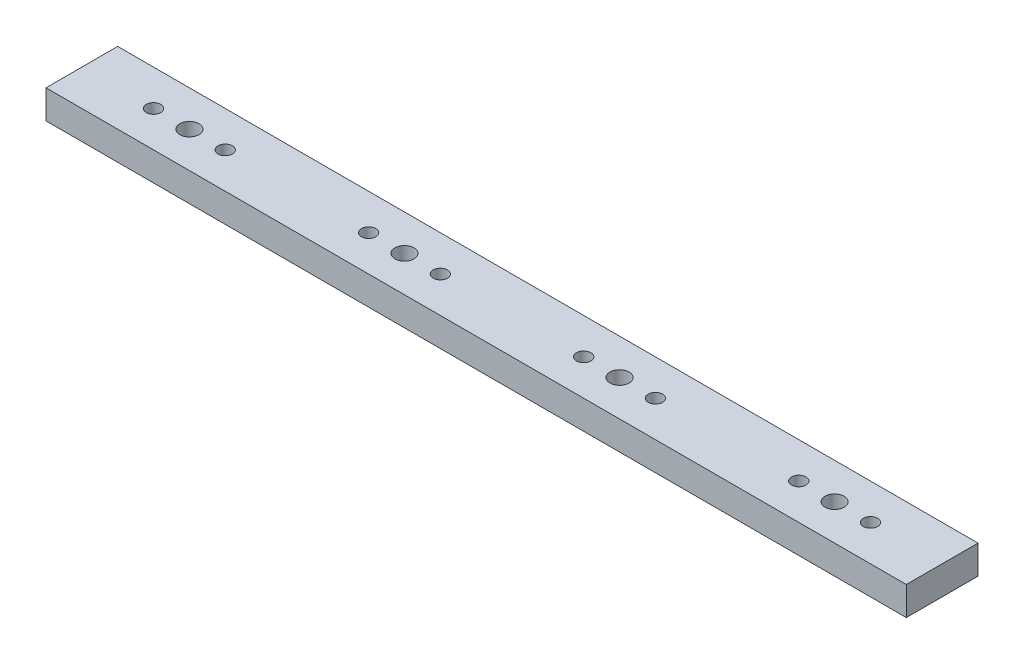
ISO-10303-21;
HEADER;
FILE_DESCRIPTION(('STEP AP214'),'2;1');
FILE_NAME('part.step','',(''),(''),'','','');
FILE_SCHEMA(('AUTOMOTIVE_DESIGN { 1 0 10303 214 1 1 1 1 }'));
ENDSEC;
DATA;
#1=APPLICATION_CONTEXT('core data for automotive mechanical design processes');
#2=APPLICATION_PROTOCOL_DEFINITION('international standard','automotive_design',2000,#1);
#3=PRODUCT_CONTEXT('',#1,'mechanical');
#4=PRODUCT('Part','Part','',(#3));
#5=PRODUCT_RELATED_PRODUCT_CATEGORY('part','',(#4));
#6=PRODUCT_DEFINITION_FORMATION('','',#4);
#7=PRODUCT_DEFINITION_CONTEXT('part definition',#1,'design');
#8=PRODUCT_DEFINITION('design','',#6,#7);
#9=PRODUCT_DEFINITION_SHAPE('','',#8);
#10=(LENGTH_UNIT() NAMED_UNIT(*) SI_UNIT(.MILLI.,.METRE.));
#11=(NAMED_UNIT(*) PLANE_ANGLE_UNIT() SI_UNIT($,.RADIAN.));
#12=(NAMED_UNIT(*) SI_UNIT($,.STERADIAN.) SOLID_ANGLE_UNIT());
#13=UNCERTAINTY_MEASURE_WITH_UNIT(LENGTH_MEASURE(1.E-05),#10,'distance_accuracy_value','');
#14=(GEOMETRIC_REPRESENTATION_CONTEXT(3) GLOBAL_UNCERTAINTY_ASSIGNED_CONTEXT((#13)) GLOBAL_UNIT_ASSIGNED_CONTEXT((#10,
#11,#12)) REPRESENTATION_CONTEXT('',''));
#15=CARTESIAN_POINT('',(0.,0.,0.));
#16=DIRECTION('',(0.,0.,1.));
#17=DIRECTION('',(1.,0.,0.));
#18=AXIS2_PLACEMENT_3D('',#15,#16,#17);
#19=CARTESIAN_POINT('',(180.,12.,15.));
#20=DIRECTION('',(-1.,0.,0.));
#21=DIRECTION('',(0.,0.,1.));
#22=AXIS2_PLACEMENT_3D('',#19,#20,#21);
#23=PLANE('',#22);
#24=DIRECTION('',(0.,0.,-1.));
#25=VECTOR('',#24,1.);
#26=CARTESIAN_POINT('',(180.,0.,15.));
#27=LINE('',#26,#25);
#28=CARTESIAN_POINT('',(180.,0.,15.));
#29=VERTEX_POINT('',#28);
#30=CARTESIAN_POINT('',(180.,0.,-15.));
#31=VERTEX_POINT('',#30);
#32=EDGE_CURVE('E101',#29,#31,#27,.T.);
#33=ORIENTED_EDGE('',*,*,#32,.T.);
#34=DIRECTION('',(0.,-1.,0.));
#35=VECTOR('',#34,1.);
#36=CARTESIAN_POINT('',(180.,12.,-15.));
#37=LINE('',#36,#35);
#38=CARTESIAN_POINT('',(180.,12.,-15.));
#39=VERTEX_POINT('',#38);
#40=EDGE_CURVE('E92',#39,#31,#37,.T.);
#41=ORIENTED_EDGE('',*,*,#40,.F.);
#42=DIRECTION('',(0.,0.,-1.));
#43=VECTOR('',#42,1.);
#44=CARTESIAN_POINT('',(180.,12.,15.));
#45=LINE('',#44,#43);
#46=CARTESIAN_POINT('',(180.,12.,15.));
#47=VERTEX_POINT('',#46);
#48=EDGE_CURVE('E86',#47,#39,#45,.T.);
#49=ORIENTED_EDGE('',*,*,#48,.F.);
#50=DIRECTION('',(0.,-1.,0.));
#51=VECTOR('',#50,1.);
#52=CARTESIAN_POINT('',(180.,12.,15.));
#53=LINE('',#52,#51);
#54=EDGE_CURVE('E97',#47,#29,#53,.T.);
#55=ORIENTED_EDGE('',*,*,#54,.T.);
#56=EDGE_LOOP('',(#33,#41,#49,#55));
#57=FACE_BOUND('',#56,.T.);
#58=ADVANCED_FACE('F32',(#57),#23,.F.);
#59=CARTESIAN_POINT('',(-180.,12.,-15.));
#60=DIRECTION('',(0.,0.,1.));
#61=DIRECTION('',(1.,0.,0.));
#62=AXIS2_PLACEMENT_3D('',#59,#60,#61);
#63=PLANE('',#62);
#64=DIRECTION('',(-1.,0.,0.));
#65=VECTOR('',#64,1.);
#66=CARTESIAN_POINT('',(-180.,0.,-15.));
#67=LINE('',#66,#65);
#68=CARTESIAN_POINT('',(-180.,0.,-15.));
#69=VERTEX_POINT('',#68);
#70=EDGE_CURVE('E91',#31,#69,#67,.T.);
#71=ORIENTED_EDGE('',*,*,#70,.T.);
#72=DIRECTION('',(0.,-1.,0.));
#73=VECTOR('',#72,1.);
#74=CARTESIAN_POINT('',(-180.,12.,-15.));
#75=LINE('',#74,#73);
#76=CARTESIAN_POINT('',(-180.,12.,-15.));
#77=VERTEX_POINT('',#76);
#78=EDGE_CURVE('E89',#77,#69,#75,.T.);
#79=ORIENTED_EDGE('',*,*,#78,.F.);
#80=DIRECTION('',(-1.,0.,0.));
#81=VECTOR('',#80,1.);
#82=CARTESIAN_POINT('',(-180.,12.,-15.));
#83=LINE('',#82,#81);
#84=EDGE_CURVE('E80',#39,#77,#83,.T.);
#85=ORIENTED_EDGE('',*,*,#84,.F.);
#86=ORIENTED_EDGE('',*,*,#40,.T.);
#87=EDGE_LOOP('',(#71,#79,#85,#86));
#88=FACE_BOUND('',#87,.T.);
#89=ADVANCED_FACE('F90',(#88),#63,.F.);
#90=CARTESIAN_POINT('',(-180.,12.,15.));
#91=DIRECTION('',(1.,0.,0.));
#92=DIRECTION('',(0.,0.,-1.));
#93=AXIS2_PLACEMENT_3D('',#90,#91,#92);
#94=PLANE('',#93);
#95=DIRECTION('',(0.,0.,1.));
#96=VECTOR('',#95,1.);
#97=CARTESIAN_POINT('',(-180.,0.,15.));
#98=LINE('',#97,#96);
#99=CARTESIAN_POINT('',(-180.,0.,15.));
#100=VERTEX_POINT('',#99);
#101=EDGE_CURVE('E66',#69,#100,#98,.T.);
#102=ORIENTED_EDGE('',*,*,#101,.T.);
#103=DIRECTION('',(0.,-1.,0.));
#104=VECTOR('',#103,1.);
#105=CARTESIAN_POINT('',(-180.,12.,15.));
#106=LINE('',#105,#104);
#107=CARTESIAN_POINT('',(-180.,12.,15.));
#108=VERTEX_POINT('',#107);
#109=EDGE_CURVE('E93',#108,#100,#106,.T.);
#110=ORIENTED_EDGE('',*,*,#109,.F.);
#111=DIRECTION('',(0.,0.,1.));
#112=VECTOR('',#111,1.);
#113=CARTESIAN_POINT('',(-180.,12.,15.));
#114=LINE('',#113,#112);
#115=EDGE_CURVE('E84',#77,#108,#114,.T.);
#116=ORIENTED_EDGE('',*,*,#115,.F.);
#117=ORIENTED_EDGE('',*,*,#78,.T.);
#118=EDGE_LOOP('',(#102,#110,#116,#117));
#119=FACE_BOUND('',#118,.T.);
#120=ADVANCED_FACE('F95',(#119),#94,.F.);
#121=CARTESIAN_POINT('',(-180.,12.,15.));
#122=DIRECTION('',(0.,0.,-1.));
#123=DIRECTION('',(-1.,0.,0.));
#124=AXIS2_PLACEMENT_3D('',#121,#122,#123);
#125=PLANE('',#124);
#126=DIRECTION('',(1.,0.,0.));
#127=VECTOR('',#126,1.);
#128=CARTESIAN_POINT('',(-180.,0.,15.));
#129=LINE('',#128,#127);
#130=EDGE_CURVE('E72',#100,#29,#129,.T.);
#131=ORIENTED_EDGE('',*,*,#130,.T.);
#132=ORIENTED_EDGE('',*,*,#54,.F.);
#133=DIRECTION('',(1.,0.,0.));
#134=VECTOR('',#133,1.);
#135=CARTESIAN_POINT('',(-180.,12.,15.));
#136=LINE('',#135,#134);
#137=EDGE_CURVE('E49',#108,#47,#136,.T.);
#138=ORIENTED_EDGE('',*,*,#137,.F.);
#139=ORIENTED_EDGE('',*,*,#109,.T.);
#140=EDGE_LOOP('',(#131,#132,#138,#139));
#141=FACE_BOUND('',#140,.T.);
#142=ADVANCED_FACE('F151',(#141),#125,.F.);
#143=CARTESIAN_POINT('',(180.,12.,-15.));
#144=DIRECTION('',(0.,-1.,0.));
#145=DIRECTION('',(0.,0.,-1.));
#146=AXIS2_PLACEMENT_3D('',#143,#144,#145);
#147=PLANE('',#146);
#148=CARTESIAN_POINT('',(-30.,12.,0.));
#149=DIRECTION('',(0.,1.,0.));
#150=DIRECTION('',(0.,0.,1.));
#151=AXIS2_PLACEMENT_3D('',#148,#149,#150);
#152=CIRCLE('',#151,3.00000000000001);
#153=CARTESIAN_POINT('',(-30.,12.,3.00000000000001));
#154=VERTEX_POINT('',#153);
#155=EDGE_CURVE('E260',#154,#154,#152,.T.);
#156=ORIENTED_EDGE('',*,*,#155,.F.);
#157=EDGE_LOOP('',(#156));
#158=FACE_BOUND('',#157,.T.);
#159=CARTESIAN_POINT('',(-60.,12.,0.));
#160=DIRECTION('',(0.,1.,0.));
#161=DIRECTION('',(0.,0.,1.));
#162=AXIS2_PLACEMENT_3D('',#159,#160,#161);
#163=CIRCLE('',#162,2.99999999999999);
#164=CARTESIAN_POINT('',(-60.,12.,2.99999999999999));
#165=VERTEX_POINT('',#164);
#166=EDGE_CURVE('E254',#165,#165,#163,.T.);
#167=ORIENTED_EDGE('',*,*,#166,.F.);
#168=EDGE_LOOP('',(#167));
#169=FACE_BOUND('',#168,.T.);
#170=CARTESIAN_POINT('',(-45.,12.,0.));
#171=DIRECTION('',(0.,1.,0.));
#172=DIRECTION('',(0.,0.,1.));
#173=AXIS2_PLACEMENT_3D('',#170,#171,#172);
#174=CIRCLE('',#173,3.99999999999999);
#175=CARTESIAN_POINT('',(-45.,12.,3.99999999999999));
#176=VERTEX_POINT('',#175);
#177=EDGE_CURVE('E246',#176,#176,#174,.T.);
#178=ORIENTED_EDGE('',*,*,#177,.F.);
#179=EDGE_LOOP('',(#178));
#180=FACE_BOUND('',#179,.T.);
#181=CARTESIAN_POINT('',(-135.,12.,0.));
#182=DIRECTION('',(0.,1.,0.));
#183=DIRECTION('',(0.,0.,1.));
#184=AXIS2_PLACEMENT_3D('',#181,#182,#183);
#185=CIRCLE('',#184,3.99999999999999);
#186=CARTESIAN_POINT('',(-135.,12.,3.99999999999999));
#187=VERTEX_POINT('',#186);
#188=EDGE_CURVE('E240',#187,#187,#185,.T.);
#189=ORIENTED_EDGE('',*,*,#188,.F.);
#190=EDGE_LOOP('',(#189));
#191=FACE_BOUND('',#190,.T.);
#192=CARTESIAN_POINT('',(-120.,12.,0.));
#193=DIRECTION('',(0.,1.,0.));
#194=DIRECTION('',(0.,0.,1.));
#195=AXIS2_PLACEMENT_3D('',#192,#193,#194);
#196=CIRCLE('',#195,3.00000000000001);
#197=CARTESIAN_POINT('',(-120.,12.,3.00000000000001));
#198=VERTEX_POINT('',#197);
#199=EDGE_CURVE('E234',#198,#198,#196,.T.);
#200=ORIENTED_EDGE('',*,*,#199,.F.);
#201=EDGE_LOOP('',(#200));
#202=FACE_BOUND('',#201,.T.);
#203=CARTESIAN_POINT('',(-150.,12.,0.));
#204=DIRECTION('',(0.,1.,0.));
#205=DIRECTION('',(0.,0.,1.));
#206=AXIS2_PLACEMENT_3D('',#203,#204,#205);
#207=CIRCLE('',#206,2.99999999999999);
#208=CARTESIAN_POINT('',(-150.,12.,2.99999999999999));
#209=VERTEX_POINT('',#208);
#210=EDGE_CURVE('E104',#209,#209,#207,.T.);
#211=ORIENTED_EDGE('',*,*,#210,.F.);
#212=EDGE_LOOP('',(#211));
#213=FACE_BOUND('',#212,.T.);
#214=ORIENTED_EDGE('',*,*,#48,.T.);
#215=ORIENTED_EDGE('',*,*,#84,.T.);
#216=ORIENTED_EDGE('',*,*,#115,.T.);
#217=ORIENTED_EDGE('',*,*,#137,.T.);
#218=EDGE_LOOP('',(#214,#215,#216,#217));
#219=FACE_BOUND('',#218,.T.);
#220=CARTESIAN_POINT('',(45.,12.,0.));
#221=DIRECTION('',(0.,1.,0.));
#222=DIRECTION('',(0.,0.,1.));
#223=AXIS2_PLACEMENT_3D('',#220,#221,#222);
#224=CIRCLE('',#223,3.99999999999999);
#225=CARTESIAN_POINT('',(45.,12.,3.99999999999999));
#226=VERTEX_POINT('',#225);
#227=EDGE_CURVE('E114',#226,#226,#224,.T.);
#228=ORIENTED_EDGE('',*,*,#227,.F.);
#229=EDGE_LOOP('',(#228));
#230=FACE_BOUND('',#229,.T.);
#231=CARTESIAN_POINT('',(135.,12.,0.));
#232=DIRECTION('',(0.,1.,0.));
#233=DIRECTION('',(0.,0.,1.));
#234=AXIS2_PLACEMENT_3D('',#231,#232,#233);
#235=CIRCLE('',#234,3.99999999999999);
#236=CARTESIAN_POINT('',(135.,12.,3.99999999999999));
#237=VERTEX_POINT('',#236);
#238=EDGE_CURVE('E120',#237,#237,#235,.T.);
#239=ORIENTED_EDGE('',*,*,#238,.F.);
#240=EDGE_LOOP('',(#239));
#241=FACE_BOUND('',#240,.T.);
#242=CARTESIAN_POINT('',(30.,12.,0.));
#243=DIRECTION('',(0.,1.,0.));
#244=DIRECTION('',(0.,0.,1.));
#245=AXIS2_PLACEMENT_3D('',#242,#243,#244);
#246=CIRCLE('',#245,2.99999999999999);
#247=CARTESIAN_POINT('',(30.,12.,2.99999999999999));
#248=VERTEX_POINT('',#247);
#249=EDGE_CURVE('E126',#248,#248,#246,.T.);
#250=ORIENTED_EDGE('',*,*,#249,.F.);
#251=EDGE_LOOP('',(#250));
#252=FACE_BOUND('',#251,.T.);
#253=CARTESIAN_POINT('',(120.,12.,0.));
#254=DIRECTION('',(0.,1.,0.));
#255=DIRECTION('',(0.,0.,1.));
#256=AXIS2_PLACEMENT_3D('',#253,#254,#255);
#257=CIRCLE('',#256,2.99999999999999);
#258=CARTESIAN_POINT('',(120.,12.,2.99999999999999));
#259=VERTEX_POINT('',#258);
#260=EDGE_CURVE('E132',#259,#259,#257,.T.);
#261=ORIENTED_EDGE('',*,*,#260,.F.);
#262=EDGE_LOOP('',(#261));
#263=FACE_BOUND('',#262,.T.);
#264=CARTESIAN_POINT('',(60.,12.,0.));
#265=DIRECTION('',(0.,1.,0.));
#266=DIRECTION('',(0.,0.,1.));
#267=AXIS2_PLACEMENT_3D('',#264,#265,#266);
#268=CIRCLE('',#267,3.00000000000001);
#269=CARTESIAN_POINT('',(60.,12.,3.00000000000001));
#270=VERTEX_POINT('',#269);
#271=EDGE_CURVE('E138',#270,#270,#268,.T.);
#272=ORIENTED_EDGE('',*,*,#271,.F.);
#273=EDGE_LOOP('',(#272));
#274=FACE_BOUND('',#273,.T.);
#275=CARTESIAN_POINT('',(150.,12.,0.));
#276=DIRECTION('',(0.,1.,0.));
#277=DIRECTION('',(0.,0.,1.));
#278=AXIS2_PLACEMENT_3D('',#275,#276,#277);
#279=CIRCLE('',#278,3.00000000000001);
#280=CARTESIAN_POINT('',(150.,12.,3.00000000000001));
#281=VERTEX_POINT('',#280);
#282=EDGE_CURVE('E11',#281,#281,#279,.T.);
#283=ORIENTED_EDGE('',*,*,#282,.F.);
#284=EDGE_LOOP('',(#283));
#285=FACE_BOUND('',#284,.T.);
#286=ADVANCED_FACE('F81',(#158,#169,#180,#191,#202,#213,#219,#230,#241,#252,#263,#274,#285),
#147,.F.);
#287=CARTESIAN_POINT('',(180.,0.,-15.));
#288=DIRECTION('',(0.,-1.,0.));
#289=DIRECTION('',(0.,0.,-1.));
#290=AXIS2_PLACEMENT_3D('',#287,#288,#289);
#291=PLANE('',#290);
#292=CARTESIAN_POINT('',(-30.,0.,0.));
#293=DIRECTION('',(0.,-1.,0.));
#294=DIRECTION('',(0.,0.,-1.));
#295=AXIS2_PLACEMENT_3D('',#292,#293,#294);
#296=CIRCLE('',#295,3.00000000000001);
#297=CARTESIAN_POINT('',(-30.,0.,-3.00000000000001));
#298=VERTEX_POINT('',#297);
#299=EDGE_CURVE('E263',#298,#298,#296,.F.);
#300=ORIENTED_EDGE('',*,*,#299,.T.);
#301=EDGE_LOOP('',(#300));
#302=FACE_BOUND('',#301,.T.);
#303=CARTESIAN_POINT('',(-60.,0.,0.));
#304=DIRECTION('',(0.,-1.,0.));
#305=DIRECTION('',(0.,0.,-1.));
#306=AXIS2_PLACEMENT_3D('',#303,#304,#305);
#307=CIRCLE('',#306,2.99999999999999);
#308=CARTESIAN_POINT('',(-60.,0.,-2.99999999999999));
#309=VERTEX_POINT('',#308);
#310=EDGE_CURVE('E257',#309,#309,#307,.F.);
#311=ORIENTED_EDGE('',*,*,#310,.T.);
#312=EDGE_LOOP('',(#311));
#313=FACE_BOUND('',#312,.T.);
#314=CARTESIAN_POINT('',(-45.,0.,0.));
#315=DIRECTION('',(0.,-1.,0.));
#316=DIRECTION('',(0.,0.,-1.));
#317=AXIS2_PLACEMENT_3D('',#314,#315,#316);
#318=CIRCLE('',#317,3.99999999999999);
#319=CARTESIAN_POINT('',(-45.,0.,-3.99999999999999));
#320=VERTEX_POINT('',#319);
#321=EDGE_CURVE('E251',#320,#320,#318,.F.);
#322=ORIENTED_EDGE('',*,*,#321,.T.);
#323=EDGE_LOOP('',(#322));
#324=FACE_BOUND('',#323,.T.);
#325=CARTESIAN_POINT('',(-135.,0.,0.));
#326=DIRECTION('',(0.,-1.,0.));
#327=DIRECTION('',(0.,0.,-1.));
#328=AXIS2_PLACEMENT_3D('',#325,#326,#327);
#329=CIRCLE('',#328,3.99999999999999);
#330=CARTESIAN_POINT('',(-135.,0.,-3.99999999999999));
#331=VERTEX_POINT('',#330);
#332=EDGE_CURVE('E243',#331,#331,#329,.F.);
#333=ORIENTED_EDGE('',*,*,#332,.T.);
#334=EDGE_LOOP('',(#333));
#335=FACE_BOUND('',#334,.T.);
#336=CARTESIAN_POINT('',(-120.,0.,0.));
#337=DIRECTION('',(0.,-1.,0.));
#338=DIRECTION('',(0.,0.,-1.));
#339=AXIS2_PLACEMENT_3D('',#336,#337,#338);
#340=CIRCLE('',#339,3.00000000000001);
#341=CARTESIAN_POINT('',(-120.,0.,-3.00000000000001));
#342=VERTEX_POINT('',#341);
#343=EDGE_CURVE('E237',#342,#342,#340,.F.);
#344=ORIENTED_EDGE('',*,*,#343,.T.);
#345=EDGE_LOOP('',(#344));
#346=FACE_BOUND('',#345,.T.);
#347=CARTESIAN_POINT('',(-150.,0.,0.));
#348=DIRECTION('',(0.,-1.,0.));
#349=DIRECTION('',(0.,0.,-1.));
#350=AXIS2_PLACEMENT_3D('',#347,#348,#349);
#351=CIRCLE('',#350,2.99999999999999);
#352=CARTESIAN_POINT('',(-150.,0.,-2.99999999999999));
#353=VERTEX_POINT('',#352);
#354=EDGE_CURVE('E229',#353,#353,#351,.F.);
#355=ORIENTED_EDGE('',*,*,#354,.T.);
#356=EDGE_LOOP('',(#355));
#357=FACE_BOUND('',#356,.T.);
#358=ORIENTED_EDGE('',*,*,#32,.F.);
#359=ORIENTED_EDGE('',*,*,#130,.F.);
#360=ORIENTED_EDGE('',*,*,#101,.F.);
#361=ORIENTED_EDGE('',*,*,#70,.F.);
#362=EDGE_LOOP('',(#358,#359,#360,#361));
#363=FACE_BOUND('',#362,.T.);
#364=CARTESIAN_POINT('',(45.,0.,0.));
#365=DIRECTION('',(0.,-1.,0.));
#366=DIRECTION('',(0.,0.,-1.));
#367=AXIS2_PLACEMENT_3D('',#364,#365,#366);
#368=CIRCLE('',#367,3.99999999999999);
#369=CARTESIAN_POINT('',(45.,0.,-3.99999999999999));
#370=VERTEX_POINT('',#369);
#371=EDGE_CURVE('E111',#370,#370,#368,.F.);
#372=ORIENTED_EDGE('',*,*,#371,.T.);
#373=EDGE_LOOP('',(#372));
#374=FACE_BOUND('',#373,.T.);
#375=CARTESIAN_POINT('',(135.,0.,0.));
#376=DIRECTION('',(0.,-1.,0.));
#377=DIRECTION('',(0.,0.,-1.));
#378=AXIS2_PLACEMENT_3D('',#375,#376,#377);
#379=CIRCLE('',#378,3.99999999999999);
#380=CARTESIAN_POINT('',(135.,0.,-3.99999999999999));
#381=VERTEX_POINT('',#380);
#382=EDGE_CURVE('E117',#381,#381,#379,.F.);
#383=ORIENTED_EDGE('',*,*,#382,.T.);
#384=EDGE_LOOP('',(#383));
#385=FACE_BOUND('',#384,.T.);
#386=CARTESIAN_POINT('',(30.,0.,0.));
#387=DIRECTION('',(0.,-1.,0.));
#388=DIRECTION('',(0.,0.,-1.));
#389=AXIS2_PLACEMENT_3D('',#386,#387,#388);
#390=CIRCLE('',#389,2.99999999999999);
#391=CARTESIAN_POINT('',(30.,0.,-2.99999999999999));
#392=VERTEX_POINT('',#391);
#393=EDGE_CURVE('E123',#392,#392,#390,.F.);
#394=ORIENTED_EDGE('',*,*,#393,.T.);
#395=EDGE_LOOP('',(#394));
#396=FACE_BOUND('',#395,.T.);
#397=CARTESIAN_POINT('',(120.,0.,0.));
#398=DIRECTION('',(0.,-1.,0.));
#399=DIRECTION('',(0.,0.,-1.));
#400=AXIS2_PLACEMENT_3D('',#397,#398,#399);
#401=CIRCLE('',#400,2.99999999999999);
#402=CARTESIAN_POINT('',(120.,0.,-2.99999999999999));
#403=VERTEX_POINT('',#402);
#404=EDGE_CURVE('E129',#403,#403,#401,.F.);
#405=ORIENTED_EDGE('',*,*,#404,.T.);
#406=EDGE_LOOP('',(#405));
#407=FACE_BOUND('',#406,.T.);
#408=CARTESIAN_POINT('',(60.,0.,0.));
#409=DIRECTION('',(0.,-1.,0.));
#410=DIRECTION('',(0.,0.,-1.));
#411=AXIS2_PLACEMENT_3D('',#408,#409,#410);
#412=CIRCLE('',#411,3.00000000000001);
#413=CARTESIAN_POINT('',(60.,0.,-3.00000000000001));
#414=VERTEX_POINT('',#413);
#415=EDGE_CURVE('E135',#414,#414,#412,.F.);
#416=ORIENTED_EDGE('',*,*,#415,.T.);
#417=EDGE_LOOP('',(#416));
#418=FACE_BOUND('',#417,.T.);
#419=CARTESIAN_POINT('',(150.,0.,0.));
#420=DIRECTION('',(0.,-1.,0.));
#421=DIRECTION('',(0.,0.,-1.));
#422=AXIS2_PLACEMENT_3D('',#419,#420,#421);
#423=CIRCLE('',#422,3.00000000000001);
#424=CARTESIAN_POINT('',(150.,0.,-3.00000000000001));
#425=VERTEX_POINT('',#424);
#426=EDGE_CURVE('E41',#425,#425,#423,.F.);
#427=ORIENTED_EDGE('',*,*,#426,.T.);
#428=EDGE_LOOP('',(#427));
#429=FACE_BOUND('',#428,.T.);
#430=ADVANCED_FACE('F143',(#302,#313,#324,#335,#346,#357,#363,#374,#385,#396,#407,#418,#429),
#291,.T.);
#431=CARTESIAN_POINT('',(-150.,-0.000999999999999265,0.));
#432=DIRECTION('',(0.,1.,0.));
#433=DIRECTION('',(0.,0.,1.));
#434=AXIS2_PLACEMENT_3D('',#431,#432,#433);
#435=CYLINDRICAL_SURFACE('',#434,2.99999999999999);
#436=ORIENTED_EDGE('',*,*,#354,.F.);
#437=EDGE_LOOP('',(#436));
#438=FACE_BOUND('',#437,.T.);
#439=ORIENTED_EDGE('',*,*,#210,.T.);
#440=EDGE_LOOP('',(#439));
#441=FACE_BOUND('',#440,.T.);
#442=ADVANCED_FACE('F158',(#438,#441),#435,.F.);
#443=CARTESIAN_POINT('',(-120.,-0.000999999999999265,0.));
#444=DIRECTION('',(0.,1.,0.));
#445=DIRECTION('',(0.,0.,1.));
#446=AXIS2_PLACEMENT_3D('',#443,#444,#445);
#447=CYLINDRICAL_SURFACE('',#446,3.00000000000001);
#448=ORIENTED_EDGE('',*,*,#343,.F.);
#449=EDGE_LOOP('',(#448));
#450=FACE_BOUND('',#449,.T.);
#451=ORIENTED_EDGE('',*,*,#199,.T.);
#452=EDGE_LOOP('',(#451));
#453=FACE_BOUND('',#452,.T.);
#454=ADVANCED_FACE('F218',(#450,#453),#447,.F.);
#455=CARTESIAN_POINT('',(-135.,-0.000999999999999265,0.));
#456=DIRECTION('',(0.,1.,0.));
#457=DIRECTION('',(0.,0.,1.));
#458=AXIS2_PLACEMENT_3D('',#455,#456,#457);
#459=CYLINDRICAL_SURFACE('',#458,3.99999999999999);
#460=ORIENTED_EDGE('',*,*,#332,.F.);
#461=EDGE_LOOP('',(#460));
#462=FACE_BOUND('',#461,.T.);
#463=ORIENTED_EDGE('',*,*,#188,.T.);
#464=EDGE_LOOP('',(#463));
#465=FACE_BOUND('',#464,.T.);
#466=ADVANCED_FACE('F214',(#462,#465),#459,.F.);
#467=CARTESIAN_POINT('',(-45.,-0.000999999999999265,0.));
#468=DIRECTION('',(0.,1.,0.));
#469=DIRECTION('',(0.,0.,1.));
#470=AXIS2_PLACEMENT_3D('',#467,#468,#469);
#471=CYLINDRICAL_SURFACE('',#470,3.99999999999999);
#472=ORIENTED_EDGE('',*,*,#321,.F.);
#473=EDGE_LOOP('',(#472));
#474=FACE_BOUND('',#473,.T.);
#475=ORIENTED_EDGE('',*,*,#177,.T.);
#476=EDGE_LOOP('',(#475));
#477=FACE_BOUND('',#476,.T.);
#478=ADVANCED_FACE('F178',(#474,#477),#471,.F.);
#479=CARTESIAN_POINT('',(45.,-0.000999999999999265,0.));
#480=DIRECTION('',(0.,1.,0.));
#481=DIRECTION('',(0.,0.,1.));
#482=AXIS2_PLACEMENT_3D('',#479,#480,#481);
#483=CYLINDRICAL_SURFACE('',#482,3.99999999999999);
#484=ORIENTED_EDGE('',*,*,#371,.F.);
#485=EDGE_LOOP('',(#484));
#486=FACE_BOUND('',#485,.T.);
#487=ORIENTED_EDGE('',*,*,#227,.T.);
#488=EDGE_LOOP('',(#487));
#489=FACE_BOUND('',#488,.T.);
#490=ADVANCED_FACE('F174',(#486,#489),#483,.F.);
#491=CARTESIAN_POINT('',(135.,-0.000999999999999265,0.));
#492=DIRECTION('',(0.,1.,0.));
#493=DIRECTION('',(0.,0.,1.));
#494=AXIS2_PLACEMENT_3D('',#491,#492,#493);
#495=CYLINDRICAL_SURFACE('',#494,3.99999999999999);
#496=ORIENTED_EDGE('',*,*,#382,.F.);
#497=EDGE_LOOP('',(#496));
#498=FACE_BOUND('',#497,.T.);
#499=ORIENTED_EDGE('',*,*,#238,.T.);
#500=EDGE_LOOP('',(#499));
#501=FACE_BOUND('',#500,.T.);
#502=ADVANCED_FACE('F177',(#498,#501),#495,.F.);
#503=CARTESIAN_POINT('',(-60.,-0.000999999999999265,0.));
#504=DIRECTION('',(0.,1.,0.));
#505=DIRECTION('',(0.,0.,1.));
#506=AXIS2_PLACEMENT_3D('',#503,#504,#505);
#507=CYLINDRICAL_SURFACE('',#506,2.99999999999999);
#508=ORIENTED_EDGE('',*,*,#310,.F.);
#509=EDGE_LOOP('',(#508));
#510=FACE_BOUND('',#509,.T.);
#511=ORIENTED_EDGE('',*,*,#166,.T.);
#512=EDGE_LOOP('',(#511));
#513=FACE_BOUND('',#512,.T.);
#514=ADVANCED_FACE('F182',(#510,#513),#507,.F.);
#515=CARTESIAN_POINT('',(30.,-0.000999999999999265,0.));
#516=DIRECTION('',(0.,1.,0.));
#517=DIRECTION('',(0.,0.,1.));
#518=AXIS2_PLACEMENT_3D('',#515,#516,#517);
#519=CYLINDRICAL_SURFACE('',#518,2.99999999999999);
#520=ORIENTED_EDGE('',*,*,#393,.F.);
#521=EDGE_LOOP('',(#520));
#522=FACE_BOUND('',#521,.T.);
#523=ORIENTED_EDGE('',*,*,#249,.T.);
#524=EDGE_LOOP('',(#523));
#525=FACE_BOUND('',#524,.T.);
#526=ADVANCED_FACE('F184',(#522,#525),#519,.F.);
#527=CARTESIAN_POINT('',(120.,-0.000999999999999265,0.));
#528=DIRECTION('',(0.,1.,0.));
#529=DIRECTION('',(0.,0.,1.));
#530=AXIS2_PLACEMENT_3D('',#527,#528,#529);
#531=CYLINDRICAL_SURFACE('',#530,2.99999999999999);
#532=ORIENTED_EDGE('',*,*,#404,.F.);
#533=EDGE_LOOP('',(#532));
#534=FACE_BOUND('',#533,.T.);
#535=ORIENTED_EDGE('',*,*,#260,.T.);
#536=EDGE_LOOP('',(#535));
#537=FACE_BOUND('',#536,.T.);
#538=ADVANCED_FACE('F187',(#534,#537),#531,.F.);
#539=CARTESIAN_POINT('',(-30.,-0.000999999999999265,0.));
#540=DIRECTION('',(0.,1.,0.));
#541=DIRECTION('',(0.,0.,1.));
#542=AXIS2_PLACEMENT_3D('',#539,#540,#541);
#543=CYLINDRICAL_SURFACE('',#542,3.00000000000001);
#544=ORIENTED_EDGE('',*,*,#299,.F.);
#545=EDGE_LOOP('',(#544));
#546=FACE_BOUND('',#545,.T.);
#547=ORIENTED_EDGE('',*,*,#155,.T.);
#548=EDGE_LOOP('',(#547));
#549=FACE_BOUND('',#548,.T.);
#550=ADVANCED_FACE('F190',(#546,#549),#543,.F.);
#551=CARTESIAN_POINT('',(60.,-0.000999999999999265,0.));
#552=DIRECTION('',(0.,1.,0.));
#553=DIRECTION('',(0.,0.,1.));
#554=AXIS2_PLACEMENT_3D('',#551,#552,#553);
#555=CYLINDRICAL_SURFACE('',#554,3.00000000000001);
#556=ORIENTED_EDGE('',*,*,#415,.F.);
#557=EDGE_LOOP('',(#556));
#558=FACE_BOUND('',#557,.T.);
#559=ORIENTED_EDGE('',*,*,#271,.T.);
#560=EDGE_LOOP('',(#559));
#561=FACE_BOUND('',#560,.T.);
#562=ADVANCED_FACE('F147',(#558,#561),#555,.F.);
#563=CARTESIAN_POINT('',(150.,-0.000999999999999265,0.));
#564=DIRECTION('',(0.,1.,0.));
#565=DIRECTION('',(0.,0.,1.));
#566=AXIS2_PLACEMENT_3D('',#563,#564,#565);
#567=CYLINDRICAL_SURFACE('',#566,3.00000000000001);
#568=ORIENTED_EDGE('',*,*,#426,.F.);
#569=EDGE_LOOP('',(#568));
#570=FACE_BOUND('',#569,.T.);
#571=ORIENTED_EDGE('',*,*,#282,.T.);
#572=EDGE_LOOP('',(#571));
#573=FACE_BOUND('',#572,.T.);
#574=ADVANCED_FACE('F34',(#570,#573),#567,.F.);
#575=CLOSED_SHELL('',(#58,#89,#120,#142,#286,#430,#442,#454,#466,#478,#490,#502,#514,#526,#538,
#550,#562,#574));
#576=MANIFOLD_SOLID_BREP('B2',#575);
#577=ADVANCED_BREP_SHAPE_REPRESENTATION('',(#18,#576),#14);
#578=SHAPE_DEFINITION_REPRESENTATION(#9,#577);
ENDSEC;
END-ISO-10303-21;
